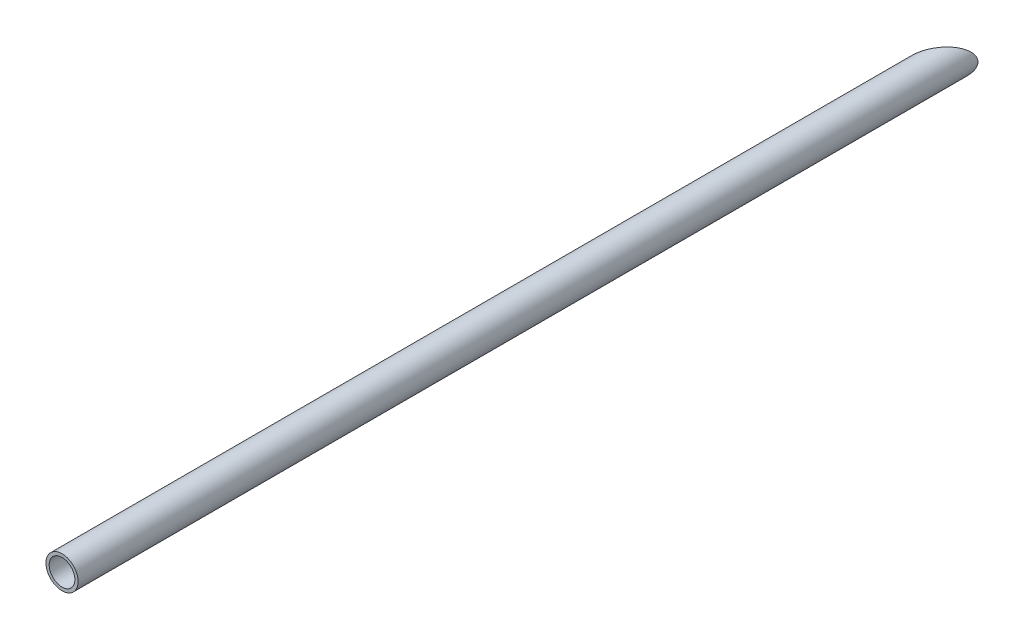
ISO-10303-21;
HEADER;
FILE_DESCRIPTION(('STEP AP214'),'2;1');
FILE_NAME('part.step','',(''),(''),'','','');
FILE_SCHEMA(('AUTOMOTIVE_DESIGN { 1 0 10303 214 1 1 1 1 }'));
ENDSEC;
DATA;
#1=APPLICATION_CONTEXT('core data for automotive mechanical design processes');
#2=APPLICATION_PROTOCOL_DEFINITION('international standard','automotive_design',2000,#1);
#3=PRODUCT_CONTEXT('',#1,'mechanical');
#4=PRODUCT('Part','Part','',(#3));
#5=PRODUCT_RELATED_PRODUCT_CATEGORY('part','',(#4));
#6=PRODUCT_DEFINITION_FORMATION('','',#4);
#7=PRODUCT_DEFINITION_CONTEXT('part definition',#1,'design');
#8=PRODUCT_DEFINITION('design','',#6,#7);
#9=PRODUCT_DEFINITION_SHAPE('','',#8);
#10=(LENGTH_UNIT() NAMED_UNIT(*) SI_UNIT(.MILLI.,.METRE.));
#11=(NAMED_UNIT(*) PLANE_ANGLE_UNIT() SI_UNIT($,.RADIAN.));
#12=(NAMED_UNIT(*) SI_UNIT($,.STERADIAN.) SOLID_ANGLE_UNIT());
#13=UNCERTAINTY_MEASURE_WITH_UNIT(LENGTH_MEASURE(1.E-05),#10,'distance_accuracy_value','');
#14=(GEOMETRIC_REPRESENTATION_CONTEXT(3) GLOBAL_UNCERTAINTY_ASSIGNED_CONTEXT((#13)) GLOBAL_UNIT_ASSIGNED_CONTEXT((#10,
#11,#12)) REPRESENTATION_CONTEXT('',''));
#15=CARTESIAN_POINT('',(0.,0.,0.));
#16=DIRECTION('',(0.,0.,1.));
#17=DIRECTION('',(1.,0.,0.));
#18=AXIS2_PLACEMENT_3D('',#15,#16,#17);
#19=CARTESIAN_POINT('',(0.,0.,889.));
#20=DIRECTION('',(0.,0.,1.));
#21=DIRECTION('',(1.,0.,0.));
#22=AXIS2_PLACEMENT_3D('',#19,#20,#21);
#23=PLANE('',#22);
#24=CARTESIAN_POINT('',(0.,0.,889.));
#25=DIRECTION('',(0.,0.,1.));
#26=DIRECTION('',(1.,0.,0.));
#27=AXIS2_PLACEMENT_3D('',#24,#25,#26);
#28=CIRCLE('',#27,15.875);
#29=CARTESIAN_POINT('',(15.875,0.,889.));
#30=VERTEX_POINT('',#29);
#31=EDGE_CURVE('E10',#30,#30,#28,.T.);
#32=ORIENTED_EDGE('',*,*,#31,.T.);
#33=EDGE_LOOP('',(#32));
#34=FACE_BOUND('',#33,.T.);
#35=CARTESIAN_POINT('',(0.,0.,889.));
#36=DIRECTION('',(0.,0.,1.));
#37=DIRECTION('',(1.,0.,0.));
#38=AXIS2_PLACEMENT_3D('',#35,#36,#37);
#39=CIRCLE('',#38,12.7);
#40=CARTESIAN_POINT('',(12.7,0.,889.));
#41=VERTEX_POINT('',#40);
#42=EDGE_CURVE('E47',#41,#41,#39,.T.);
#43=ORIENTED_EDGE('',*,*,#42,.F.);
#44=EDGE_LOOP('',(#43));
#45=FACE_BOUND('',#44,.T.);
#46=ADVANCED_FACE('F39',(#34,#45),#23,.T.);
#47=CARTESIAN_POINT('',(0.,0.,889.));
#48=DIRECTION('',(0.,0.,-1.));
#49=DIRECTION('',(-1.,0.,0.));
#50=AXIS2_PLACEMENT_3D('',#47,#48,#49);
#51=CYLINDRICAL_SURFACE('',#50,15.875);
#52=ORIENTED_EDGE('',*,*,#31,.F.);
#53=EDGE_LOOP('',(#52));
#54=FACE_BOUND('',#53,.T.);
#55=CARTESIAN_POINT('',(0.,0.,22.6718496070308));
#56=DIRECTION('',(0.819152044288989,0.,0.57357643635105));
#57=DIRECTION('',(0.57357643635105,0.,-0.819152044288989));
#58=AXIS2_PLACEMENT_3D('',#55,#56,#57);
#59=ELLIPSE('',#58,27.6772178804847,15.875);
#60=CARTESIAN_POINT('',(15.875,0.,0.));
#61=VERTEX_POINT('',#60);
#62=EDGE_CURVE('E51',#61,#61,#59,.T.);
#63=ORIENTED_EDGE('',*,*,#62,.T.);
#64=EDGE_LOOP('',(#63));
#65=FACE_BOUND('',#64,.T.);
#66=ADVANCED_FACE('F41',(#54,#65),#51,.T.);
#67=CARTESIAN_POINT('',(0.,0.,889.));
#68=DIRECTION('',(0.,0.,-1.));
#69=DIRECTION('',(-1.,0.,0.));
#70=AXIS2_PLACEMENT_3D('',#67,#68,#69);
#71=CYLINDRICAL_SURFACE('',#70,12.7);
#72=CARTESIAN_POINT('',(0.,0.,22.6718496070308));
#73=DIRECTION('',(0.819152044288989,0.,0.57357643635105));
#74=DIRECTION('',(0.57357643635105,0.,-0.819152044288989));
#75=AXIS2_PLACEMENT_3D('',#72,#73,#74);
#76=ELLIPSE('',#75,22.1417743043878,12.7);
#77=CARTESIAN_POINT('',(12.7,0.,4.53436992140617));
#78=VERTEX_POINT('',#77);
#79=EDGE_CURVE('E43',#78,#78,#76,.T.);
#80=ORIENTED_EDGE('',*,*,#79,.F.);
#81=EDGE_LOOP('',(#80));
#82=FACE_BOUND('',#81,.T.);
#83=ORIENTED_EDGE('',*,*,#42,.T.);
#84=EDGE_LOOP('',(#83));
#85=FACE_BOUND('',#84,.T.);
#86=ADVANCED_FACE('F63',(#82,#85),#71,.F.);
#87=CARTESIAN_POINT('',(15.875,-15.875,0.));
#88=DIRECTION('',(0.819152044288989,0.,0.57357643635105));
#89=DIRECTION('',(0.57357643635105,0.,-0.819152044288989));
#90=AXIS2_PLACEMENT_3D('',#87,#88,#89);
#91=PLANE('',#90);
#92=ORIENTED_EDGE('',*,*,#79,.T.);
#93=EDGE_LOOP('',(#92));
#94=FACE_BOUND('',#93,.T.);
#95=ORIENTED_EDGE('',*,*,#62,.F.);
#96=EDGE_LOOP('',(#95));
#97=FACE_BOUND('',#96,.T.);
#98=ADVANCED_FACE('F60',(#94,#97),#91,.F.);
#99=CLOSED_SHELL('',(#46,#66,#86,#98));
#100=MANIFOLD_SOLID_BREP('B2',#99);
#101=ADVANCED_BREP_SHAPE_REPRESENTATION('',(#18,#100),#14);
#102=SHAPE_DEFINITION_REPRESENTATION(#9,#101);
ENDSEC;
END-ISO-10303-21;
